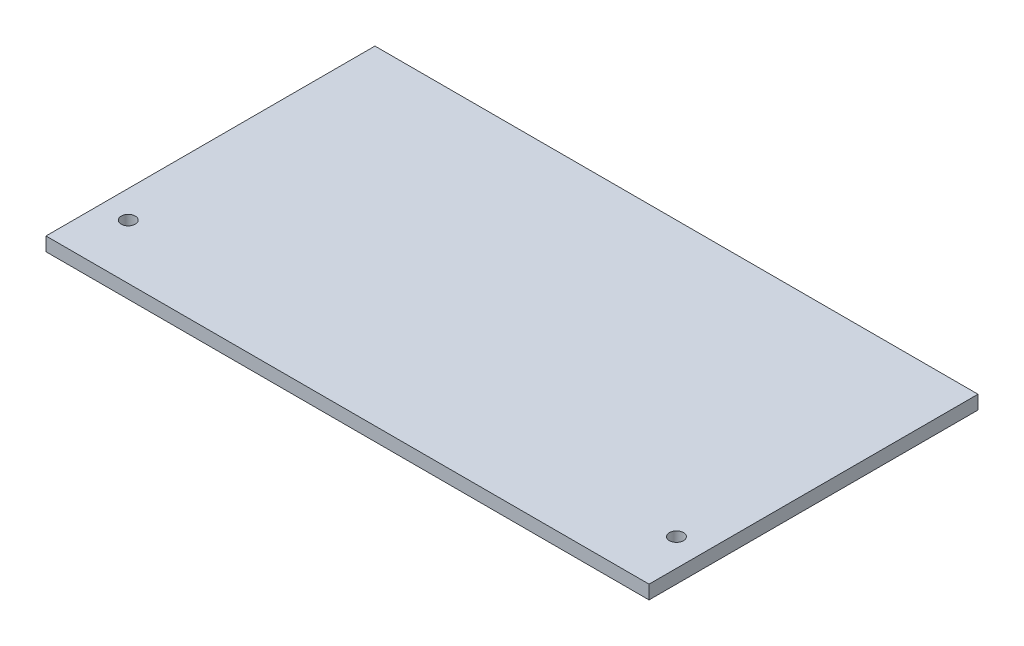
ISO-10303-21;
HEADER;
FILE_DESCRIPTION(('STEP AP214'),'2;1');
FILE_NAME('part.step','',(''),(''),'','','');
FILE_SCHEMA(('AUTOMOTIVE_DESIGN { 1 0 10303 214 1 1 1 1 }'));
ENDSEC;
DATA;
#1=APPLICATION_CONTEXT('core data for automotive mechanical design processes');
#2=APPLICATION_PROTOCOL_DEFINITION('international standard','automotive_design',2000,#1);
#3=PRODUCT_CONTEXT('',#1,'mechanical');
#4=PRODUCT('Part','Part','',(#3));
#5=PRODUCT_RELATED_PRODUCT_CATEGORY('part','',(#4));
#6=PRODUCT_DEFINITION_FORMATION('','',#4);
#7=PRODUCT_DEFINITION_CONTEXT('part definition',#1,'design');
#8=PRODUCT_DEFINITION('design','',#6,#7);
#9=PRODUCT_DEFINITION_SHAPE('','',#8);
#10=(LENGTH_UNIT() NAMED_UNIT(*) SI_UNIT(.MILLI.,.METRE.));
#11=(NAMED_UNIT(*) PLANE_ANGLE_UNIT() SI_UNIT($,.RADIAN.));
#12=(NAMED_UNIT(*) SI_UNIT($,.STERADIAN.) SOLID_ANGLE_UNIT());
#13=UNCERTAINTY_MEASURE_WITH_UNIT(LENGTH_MEASURE(1.E-05),#10,'distance_accuracy_value','');
#14=(GEOMETRIC_REPRESENTATION_CONTEXT(3) GLOBAL_UNCERTAINTY_ASSIGNED_CONTEXT((#13)) GLOBAL_UNIT_ASSIGNED_CONTEXT((#10,
#11,#12)) REPRESENTATION_CONTEXT('',''));
#15=CARTESIAN_POINT('',(0.,0.,0.));
#16=DIRECTION('',(0.,0.,1.));
#17=DIRECTION('',(1.,0.,0.));
#18=AXIS2_PLACEMENT_3D('',#15,#16,#17);
#19=CARTESIAN_POINT('',(-139.7,6.35,-76.2));
#20=DIRECTION('',(1.,0.,0.));
#21=DIRECTION('',(0.,0.,-1.));
#22=AXIS2_PLACEMENT_3D('',#19,#20,#21);
#23=PLANE('',#22);
#24=DIRECTION('',(0.,0.,1.));
#25=VECTOR('',#24,1.);
#26=CARTESIAN_POINT('',(-139.7,0.,-76.2));
#27=LINE('',#26,#25);
#28=CARTESIAN_POINT('',(-139.7,0.,-76.2));
#29=VERTEX_POINT('',#28);
#30=CARTESIAN_POINT('',(-139.7,0.,76.2));
#31=VERTEX_POINT('',#30);
#32=EDGE_CURVE('E102',#29,#31,#27,.T.);
#33=ORIENTED_EDGE('',*,*,#32,.T.);
#34=DIRECTION('',(0.,-1.,0.));
#35=VECTOR('',#34,1.);
#36=CARTESIAN_POINT('',(-139.7,6.35,76.2));
#37=LINE('',#36,#35);
#38=CARTESIAN_POINT('',(-139.7,6.35,76.2));
#39=VERTEX_POINT('',#38);
#40=EDGE_CURVE('E11',#39,#31,#37,.T.);
#41=ORIENTED_EDGE('',*,*,#40,.F.);
#42=DIRECTION('',(0.,0.,1.));
#43=VECTOR('',#42,1.);
#44=CARTESIAN_POINT('',(-139.7,6.35,-76.2));
#45=LINE('',#44,#43);
#46=CARTESIAN_POINT('',(-139.7,6.35,-76.2));
#47=VERTEX_POINT('',#46);
#48=EDGE_CURVE('E90',#47,#39,#45,.T.);
#49=ORIENTED_EDGE('',*,*,#48,.F.);
#50=DIRECTION('',(0.,-1.,0.));
#51=VECTOR('',#50,1.);
#52=CARTESIAN_POINT('',(-139.7,6.35,-76.2));
#53=LINE('',#52,#51);
#54=EDGE_CURVE('E98',#47,#29,#53,.T.);
#55=ORIENTED_EDGE('',*,*,#54,.T.);
#56=EDGE_LOOP('',(#33,#41,#49,#55));
#57=FACE_BOUND('',#56,.T.);
#58=ADVANCED_FACE('F39',(#57),#23,.F.);
#59=CARTESIAN_POINT('',(-139.7,6.35,76.2));
#60=DIRECTION('',(0.,0.,-1.));
#61=DIRECTION('',(-1.,0.,0.));
#62=AXIS2_PLACEMENT_3D('',#59,#60,#61);
#63=PLANE('',#62);
#64=DIRECTION('',(1.,0.,0.));
#65=VECTOR('',#64,1.);
#66=CARTESIAN_POINT('',(-139.7,0.,76.2));
#67=LINE('',#66,#65);
#68=CARTESIAN_POINT('',(139.7,0.,76.2));
#69=VERTEX_POINT('',#68);
#70=EDGE_CURVE('E94',#31,#69,#67,.T.);
#71=ORIENTED_EDGE('',*,*,#70,.T.);
#72=DIRECTION('',(0.,-1.,0.));
#73=VECTOR('',#72,1.);
#74=CARTESIAN_POINT('',(139.7,6.35,76.2));
#75=LINE('',#74,#73);
#76=CARTESIAN_POINT('',(139.7,6.35,76.2));
#77=VERTEX_POINT('',#76);
#78=EDGE_CURVE('E47',#77,#69,#75,.T.);
#79=ORIENTED_EDGE('',*,*,#78,.F.);
#80=DIRECTION('',(1.,0.,0.));
#81=VECTOR('',#80,1.);
#82=CARTESIAN_POINT('',(-139.7,6.35,76.2));
#83=LINE('',#82,#81);
#84=EDGE_CURVE('E85',#39,#77,#83,.T.);
#85=ORIENTED_EDGE('',*,*,#84,.F.);
#86=ORIENTED_EDGE('',*,*,#40,.T.);
#87=EDGE_LOOP('',(#71,#79,#85,#86));
#88=FACE_BOUND('',#87,.T.);
#89=ADVANCED_FACE('F93',(#88),#63,.F.);
#90=CARTESIAN_POINT('',(139.7,6.35,-76.2));
#91=DIRECTION('',(-1.,0.,0.));
#92=DIRECTION('',(0.,0.,1.));
#93=AXIS2_PLACEMENT_3D('',#90,#91,#92);
#94=PLANE('',#93);
#95=DIRECTION('',(0.,0.,-1.));
#96=VECTOR('',#95,1.);
#97=CARTESIAN_POINT('',(139.7,0.,-76.2));
#98=LINE('',#97,#96);
#99=CARTESIAN_POINT('',(139.7,0.,-76.2));
#100=VERTEX_POINT('',#99);
#101=EDGE_CURVE('E72',#69,#100,#98,.T.);
#102=ORIENTED_EDGE('',*,*,#101,.T.);
#103=DIRECTION('',(0.,-1.,0.));
#104=VECTOR('',#103,1.);
#105=CARTESIAN_POINT('',(139.7,6.35,-76.2));
#106=LINE('',#105,#104);
#107=CARTESIAN_POINT('',(139.7,6.35,-76.2));
#108=VERTEX_POINT('',#107);
#109=EDGE_CURVE('E95',#108,#100,#106,.T.);
#110=ORIENTED_EDGE('',*,*,#109,.F.);
#111=DIRECTION('',(0.,0.,-1.));
#112=VECTOR('',#111,1.);
#113=CARTESIAN_POINT('',(139.7,6.35,-76.2));
#114=LINE('',#113,#112);
#115=EDGE_CURVE('E88',#77,#108,#114,.T.);
#116=ORIENTED_EDGE('',*,*,#115,.F.);
#117=ORIENTED_EDGE('',*,*,#78,.T.);
#118=EDGE_LOOP('',(#102,#110,#116,#117));
#119=FACE_BOUND('',#118,.T.);
#120=ADVANCED_FACE('F96',(#119),#94,.F.);
#121=CARTESIAN_POINT('',(-139.7,6.35,-76.2));
#122=DIRECTION('',(0.,0.,1.));
#123=DIRECTION('',(1.,0.,0.));
#124=AXIS2_PLACEMENT_3D('',#121,#122,#123);
#125=PLANE('',#124);
#126=DIRECTION('',(-1.,0.,0.));
#127=VECTOR('',#126,1.);
#128=CARTESIAN_POINT('',(-139.7,0.,-76.2));
#129=LINE('',#128,#127);
#130=EDGE_CURVE('E78',#100,#29,#129,.T.);
#131=ORIENTED_EDGE('',*,*,#130,.T.);
#132=ORIENTED_EDGE('',*,*,#54,.F.);
#133=DIRECTION('',(-1.,0.,0.));
#134=VECTOR('',#133,1.);
#135=CARTESIAN_POINT('',(-139.7,6.35,-76.2));
#136=LINE('',#135,#134);
#137=EDGE_CURVE('E55',#108,#47,#136,.T.);
#138=ORIENTED_EDGE('',*,*,#137,.F.);
#139=ORIENTED_EDGE('',*,*,#109,.T.);
#140=EDGE_LOOP('',(#131,#132,#138,#139));
#141=FACE_BOUND('',#140,.T.);
#142=ADVANCED_FACE('F110',(#141),#125,.F.);
#143=CARTESIAN_POINT('',(0.,6.35,0.));
#144=DIRECTION('',(0.,1.,0.));
#145=DIRECTION('',(0.,0.,1.));
#146=AXIS2_PLACEMENT_3D('',#143,#144,#145);
#147=PLANE('',#146);
#148=CARTESIAN_POINT('',(-127.,6.35,50.8));
#149=DIRECTION('',(0.,1.,0.));
#150=DIRECTION('',(0.,0.,1.));
#151=AXIS2_PLACEMENT_3D('',#148,#149,#150);
#152=CIRCLE('',#151,3.2639);
#153=CARTESIAN_POINT('',(-127.,6.35,54.0639));
#154=VERTEX_POINT('',#153);
#155=EDGE_CURVE('E124',#154,#154,#152,.T.);
#156=ORIENTED_EDGE('',*,*,#155,.F.);
#157=EDGE_LOOP('',(#156));
#158=FACE_BOUND('',#157,.T.);
#159=CARTESIAN_POINT('',(127.,6.35,50.8));
#160=DIRECTION('',(0.,1.,0.));
#161=DIRECTION('',(0.,0.,1.));
#162=AXIS2_PLACEMENT_3D('',#159,#160,#161);
#163=CIRCLE('',#162,3.26389999999999);
#164=CARTESIAN_POINT('',(127.,6.35,54.0639));
#165=VERTEX_POINT('',#164);
#166=EDGE_CURVE('E118',#165,#165,#163,.T.);
#167=ORIENTED_EDGE('',*,*,#166,.F.);
#168=EDGE_LOOP('',(#167));
#169=FACE_BOUND('',#168,.T.);
#170=ORIENTED_EDGE('',*,*,#48,.T.);
#171=ORIENTED_EDGE('',*,*,#84,.T.);
#172=ORIENTED_EDGE('',*,*,#115,.T.);
#173=ORIENTED_EDGE('',*,*,#137,.T.);
#174=EDGE_LOOP('',(#170,#171,#172,#173));
#175=FACE_BOUND('',#174,.T.);
#176=ADVANCED_FACE('F86',(#158,#169,#175),#147,.T.);
#177=CARTESIAN_POINT('',(0.,0.,0.));
#178=DIRECTION('',(0.,1.,0.));
#179=DIRECTION('',(0.,0.,1.));
#180=AXIS2_PLACEMENT_3D('',#177,#178,#179);
#181=PLANE('',#180);
#182=CARTESIAN_POINT('',(-127.,0.,50.8));
#183=DIRECTION('',(0.,1.,0.));
#184=DIRECTION('',(0.,0.,1.));
#185=AXIS2_PLACEMENT_3D('',#182,#183,#184);
#186=CIRCLE('',#185,3.2639);
#187=CARTESIAN_POINT('',(-127.,0.,54.0639));
#188=VERTEX_POINT('',#187);
#189=EDGE_CURVE('E121',#188,#188,#186,.T.);
#190=ORIENTED_EDGE('',*,*,#189,.T.);
#191=EDGE_LOOP('',(#190));
#192=FACE_BOUND('',#191,.T.);
#193=CARTESIAN_POINT('',(127.,0.,50.8));
#194=DIRECTION('',(0.,1.,0.));
#195=DIRECTION('',(0.,0.,1.));
#196=AXIS2_PLACEMENT_3D('',#193,#194,#195);
#197=CIRCLE('',#196,3.26389999999999);
#198=CARTESIAN_POINT('',(127.,0.,54.0639));
#199=VERTEX_POINT('',#198);
#200=EDGE_CURVE('E105',#199,#199,#197,.T.);
#201=ORIENTED_EDGE('',*,*,#200,.T.);
#202=EDGE_LOOP('',(#201));
#203=FACE_BOUND('',#202,.T.);
#204=ORIENTED_EDGE('',*,*,#32,.F.);
#205=ORIENTED_EDGE('',*,*,#130,.F.);
#206=ORIENTED_EDGE('',*,*,#101,.F.);
#207=ORIENTED_EDGE('',*,*,#70,.F.);
#208=EDGE_LOOP('',(#204,#205,#206,#207));
#209=FACE_BOUND('',#208,.T.);
#210=ADVANCED_FACE('F113',(#192,#203,#209),#181,.F.);
#211=CARTESIAN_POINT('',(127.,6.35,50.8));
#212=DIRECTION('',(0.,1.,0.));
#213=DIRECTION('',(0.,0.,1.));
#214=AXIS2_PLACEMENT_3D('',#211,#212,#213);
#215=CYLINDRICAL_SURFACE('',#214,3.26389999999999);
#216=ORIENTED_EDGE('',*,*,#200,.F.);
#217=EDGE_LOOP('',(#216));
#218=FACE_BOUND('',#217,.T.);
#219=ORIENTED_EDGE('',*,*,#166,.T.);
#220=EDGE_LOOP('',(#219));
#221=FACE_BOUND('',#220,.T.);
#222=ADVANCED_FACE('F135',(#218,#221),#215,.F.);
#223=CARTESIAN_POINT('',(-127.,6.35,50.8));
#224=DIRECTION('',(0.,1.,0.));
#225=DIRECTION('',(0.,0.,1.));
#226=AXIS2_PLACEMENT_3D('',#223,#224,#225);
#227=CYLINDRICAL_SURFACE('',#226,3.2639);
#228=ORIENTED_EDGE('',*,*,#189,.F.);
#229=EDGE_LOOP('',(#228));
#230=FACE_BOUND('',#229,.T.);
#231=ORIENTED_EDGE('',*,*,#155,.T.);
#232=EDGE_LOOP('',(#231));
#233=FACE_BOUND('',#232,.T.);
#234=ADVANCED_FACE('F128',(#230,#233),#227,.F.);
#235=CLOSED_SHELL('',(#58,#89,#120,#142,#176,#210,#222,#234));
#236=MANIFOLD_SOLID_BREP('B2',#235);
#237=ADVANCED_BREP_SHAPE_REPRESENTATION('',(#18,#236),#14);
#238=SHAPE_DEFINITION_REPRESENTATION(#9,#237);
ENDSEC;
END-ISO-10303-21;
